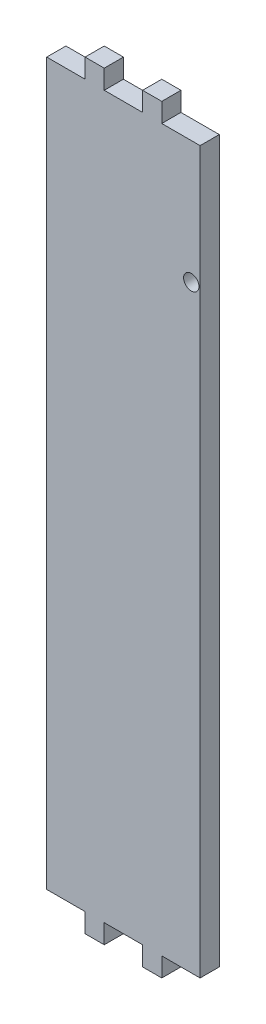
ISO-10303-21;
HEADER;
FILE_DESCRIPTION(('STEP AP214'),'2;1');
FILE_NAME('part.step','',(''),(''),'','','');
FILE_SCHEMA(('AUTOMOTIVE_DESIGN { 1 0 10303 214 1 1 1 1 }'));
ENDSEC;
DATA;
#1=APPLICATION_CONTEXT('core data for automotive mechanical design processes');
#2=APPLICATION_PROTOCOL_DEFINITION('international standard','automotive_design',2000,#1);
#3=PRODUCT_CONTEXT('',#1,'mechanical');
#4=PRODUCT('Part','Part','',(#3));
#5=PRODUCT_RELATED_PRODUCT_CATEGORY('part','',(#4));
#6=PRODUCT_DEFINITION_FORMATION('','',#4);
#7=PRODUCT_DEFINITION_CONTEXT('part definition',#1,'design');
#8=PRODUCT_DEFINITION('design','',#6,#7);
#9=PRODUCT_DEFINITION_SHAPE('','',#8);
#10=(LENGTH_UNIT() NAMED_UNIT(*) SI_UNIT(.MILLI.,.METRE.));
#11=(NAMED_UNIT(*) PLANE_ANGLE_UNIT() SI_UNIT($,.RADIAN.));
#12=(NAMED_UNIT(*) SI_UNIT($,.STERADIAN.) SOLID_ANGLE_UNIT());
#13=UNCERTAINTY_MEASURE_WITH_UNIT(LENGTH_MEASURE(1.E-05),#10,'distance_accuracy_value','');
#14=(GEOMETRIC_REPRESENTATION_CONTEXT(3) GLOBAL_UNCERTAINTY_ASSIGNED_CONTEXT((#13)) GLOBAL_UNIT_ASSIGNED_CONTEXT((#10,
#11,#12)) REPRESENTATION_CONTEXT('',''));
#15=CARTESIAN_POINT('',(0.,0.,0.));
#16=DIRECTION('',(0.,0.,1.));
#17=DIRECTION('',(1.,0.,0.));
#18=AXIS2_PLACEMENT_3D('',#15,#16,#17);
#19=CARTESIAN_POINT('',(10.0000000000001,0.,5.));
#20=DIRECTION('',(1.,0.,0.));
#21=DIRECTION('',(0.,1.,0.));
#22=AXIS2_PLACEMENT_3D('',#19,#20,#21);
#23=PLANE('',#22);
#24=DIRECTION('',(0.,-1.,0.));
#25=VECTOR('',#24,1.);
#26=CARTESIAN_POINT('',(10.0000000000001,0.,0.));
#27=LINE('',#26,#25);
#28=CARTESIAN_POINT('',(10.,193.,0.));
#29=VERTEX_POINT('',#28);
#30=CARTESIAN_POINT('',(10.,188.,0.));
#31=VERTEX_POINT('',#30);
#32=EDGE_CURVE('E207',#29,#31,#27,.T.);
#33=ORIENTED_EDGE('',*,*,#32,.F.);
#34=DIRECTION('',(0.,0.,-1.));
#35=VECTOR('',#34,1.);
#36=CARTESIAN_POINT('',(10.,193.,5.));
#37=LINE('',#36,#35);
#38=CARTESIAN_POINT('',(10.,193.,5.));
#39=VERTEX_POINT('',#38);
#40=EDGE_CURVE('E11',#39,#29,#37,.T.);
#41=ORIENTED_EDGE('',*,*,#40,.F.);
#42=DIRECTION('',(0.,-1.,0.));
#43=VECTOR('',#42,1.);
#44=CARTESIAN_POINT('',(10.0000000000001,0.,5.));
#45=LINE('',#44,#43);
#46=CARTESIAN_POINT('',(10.,188.,5.));
#47=VERTEX_POINT('',#46);
#48=EDGE_CURVE('E258',#39,#47,#45,.T.);
#49=ORIENTED_EDGE('',*,*,#48,.T.);
#50=DIRECTION('',(0.,0.,-1.));
#51=VECTOR('',#50,1.);
#52=CARTESIAN_POINT('',(10.,188.,5.));
#53=LINE('',#52,#51);
#54=EDGE_CURVE('E126',#47,#31,#53,.T.);
#55=ORIENTED_EDGE('',*,*,#54,.T.);
#56=EDGE_LOOP('',(#33,#41,#49,#55));
#57=FACE_BOUND('',#56,.T.);
#58=ADVANCED_FACE('F39',(#57),#23,.T.);
#59=CARTESIAN_POINT('',(0.,193.,5.));
#60=DIRECTION('',(0.,1.,0.));
#61=DIRECTION('',(0.,0.,1.));
#62=AXIS2_PLACEMENT_3D('',#59,#60,#61);
#63=PLANE('',#62);
#64=DIRECTION('',(1.,0.,0.));
#65=VECTOR('',#64,1.);
#66=CARTESIAN_POINT('',(0.,193.,0.));
#67=LINE('',#66,#65);
#68=CARTESIAN_POINT('',(5.,193.,0.));
#69=VERTEX_POINT('',#68);
#70=EDGE_CURVE('E210',#69,#29,#67,.T.);
#71=ORIENTED_EDGE('',*,*,#70,.F.);
#72=DIRECTION('',(0.,0.,-1.));
#73=VECTOR('',#72,1.);
#74=CARTESIAN_POINT('',(5.,193.,5.));
#75=LINE('',#74,#73);
#76=CARTESIAN_POINT('',(5.,193.,5.));
#77=VERTEX_POINT('',#76);
#78=EDGE_CURVE('E47',#77,#69,#75,.T.);
#79=ORIENTED_EDGE('',*,*,#78,.F.);
#80=DIRECTION('',(1.,0.,0.));
#81=VECTOR('',#80,1.);
#82=CARTESIAN_POINT('',(0.,193.,5.));
#83=LINE('',#82,#81);
#84=EDGE_CURVE('E319',#77,#39,#83,.T.);
#85=ORIENTED_EDGE('',*,*,#84,.T.);
#86=ORIENTED_EDGE('',*,*,#40,.T.);
#87=EDGE_LOOP('',(#71,#79,#85,#86));
#88=FACE_BOUND('',#87,.T.);
#89=ADVANCED_FACE('F305',(#88),#63,.T.);
#90=CARTESIAN_POINT('',(5.00000000000007,0.,5.));
#91=DIRECTION('',(-1.,0.,0.));
#92=DIRECTION('',(0.,-1.,0.));
#93=AXIS2_PLACEMENT_3D('',#90,#91,#92);
#94=PLANE('',#93);
#95=DIRECTION('',(0.,1.,0.));
#96=VECTOR('',#95,1.);
#97=CARTESIAN_POINT('',(5.00000000000007,0.,0.));
#98=LINE('',#97,#96);
#99=CARTESIAN_POINT('',(5.,188.,0.));
#100=VERTEX_POINT('',#99);
#101=EDGE_CURVE('E213',#100,#69,#98,.T.);
#102=ORIENTED_EDGE('',*,*,#101,.F.);
#103=DIRECTION('',(0.,0.,-1.));
#104=VECTOR('',#103,1.);
#105=CARTESIAN_POINT('',(5.,188.,5.));
#106=LINE('',#105,#104);
#107=CARTESIAN_POINT('',(5.,188.,5.));
#108=VERTEX_POINT('',#107);
#109=EDGE_CURVE('E294',#108,#100,#106,.T.);
#110=ORIENTED_EDGE('',*,*,#109,.F.);
#111=DIRECTION('',(0.,1.,0.));
#112=VECTOR('',#111,1.);
#113=CARTESIAN_POINT('',(5.00000000000007,0.,5.));
#114=LINE('',#113,#112);
#115=EDGE_CURVE('E301',#108,#77,#114,.T.);
#116=ORIENTED_EDGE('',*,*,#115,.T.);
#117=ORIENTED_EDGE('',*,*,#78,.T.);
#118=EDGE_LOOP('',(#102,#110,#116,#117));
#119=FACE_BOUND('',#118,.T.);
#120=ADVANCED_FACE('F299',(#119),#94,.T.);
#121=CARTESIAN_POINT('',(0.,188.,5.));
#122=DIRECTION('',(0.,1.,0.));
#123=DIRECTION('',(0.,0.,1.));
#124=AXIS2_PLACEMENT_3D('',#121,#122,#123);
#125=PLANE('',#124);
#126=DIRECTION('',(1.,0.,0.));
#127=VECTOR('',#126,1.);
#128=CARTESIAN_POINT('',(0.,188.,0.));
#129=LINE('',#128,#127);
#130=CARTESIAN_POINT('',(-5.,188.,0.));
#131=VERTEX_POINT('',#130);
#132=EDGE_CURVE('E216',#131,#100,#129,.T.);
#133=ORIENTED_EDGE('',*,*,#132,.F.);
#134=DIRECTION('',(0.,0.,-1.));
#135=VECTOR('',#134,1.);
#136=CARTESIAN_POINT('',(-5.,188.,5.));
#137=LINE('',#136,#135);
#138=CARTESIAN_POINT('',(-5.,188.,5.));
#139=VERTEX_POINT('',#138);
#140=EDGE_CURVE('E292',#139,#131,#137,.T.);
#141=ORIENTED_EDGE('',*,*,#140,.F.);
#142=DIRECTION('',(1.,0.,0.));
#143=VECTOR('',#142,1.);
#144=CARTESIAN_POINT('',(0.,188.,5.));
#145=LINE('',#144,#143);
#146=EDGE_CURVE('E316',#139,#108,#145,.T.);
#147=ORIENTED_EDGE('',*,*,#146,.T.);
#148=ORIENTED_EDGE('',*,*,#109,.T.);
#149=EDGE_LOOP('',(#133,#141,#147,#148));
#150=FACE_BOUND('',#149,.T.);
#151=ADVANCED_FACE('F313',(#150),#125,.T.);
#152=CARTESIAN_POINT('',(-4.99999999999994,0.,5.));
#153=DIRECTION('',(1.,0.,0.));
#154=DIRECTION('',(0.,1.,0.));
#155=AXIS2_PLACEMENT_3D('',#152,#153,#154);
#156=PLANE('',#155);
#157=DIRECTION('',(0.,-1.,0.));
#158=VECTOR('',#157,1.);
#159=CARTESIAN_POINT('',(-4.99999999999994,0.,0.));
#160=LINE('',#159,#158);
#161=CARTESIAN_POINT('',(-5.,193.,0.));
#162=VERTEX_POINT('',#161);
#163=EDGE_CURVE('E219',#162,#131,#160,.T.);
#164=ORIENTED_EDGE('',*,*,#163,.F.);
#165=DIRECTION('',(0.,0.,-1.));
#166=VECTOR('',#165,1.);
#167=CARTESIAN_POINT('',(-5.,193.,5.));
#168=LINE('',#167,#166);
#169=CARTESIAN_POINT('',(-5.,193.,5.));
#170=VERTEX_POINT('',#169);
#171=EDGE_CURVE('E290',#170,#162,#168,.T.);
#172=ORIENTED_EDGE('',*,*,#171,.F.);
#173=DIRECTION('',(0.,-1.,0.));
#174=VECTOR('',#173,1.);
#175=CARTESIAN_POINT('',(-4.99999999999994,0.,5.));
#176=LINE('',#175,#174);
#177=EDGE_CURVE('E321',#170,#139,#176,.T.);
#178=ORIENTED_EDGE('',*,*,#177,.T.);
#179=ORIENTED_EDGE('',*,*,#140,.T.);
#180=EDGE_LOOP('',(#164,#172,#178,#179));
#181=FACE_BOUND('',#180,.T.);
#182=ADVANCED_FACE('F376',(#181),#156,.T.);
#183=CARTESIAN_POINT('',(0.,193.,5.));
#184=DIRECTION('',(0.,-1.,0.));
#185=DIRECTION('',(0.,0.,-1.));
#186=AXIS2_PLACEMENT_3D('',#183,#184,#185);
#187=PLANE('',#186);
#188=DIRECTION('',(-1.,0.,0.));
#189=VECTOR('',#188,1.);
#190=CARTESIAN_POINT('',(0.,193.,0.));
#191=LINE('',#190,#189);
#192=CARTESIAN_POINT('',(-10.,193.,0.));
#193=VERTEX_POINT('',#192);
#194=EDGE_CURVE('E222',#162,#193,#191,.T.);
#195=ORIENTED_EDGE('',*,*,#194,.T.);
#196=DIRECTION('',(0.,0.,-1.));
#197=VECTOR('',#196,1.);
#198=CARTESIAN_POINT('',(-10.,193.,5.));
#199=LINE('',#198,#197);
#200=CARTESIAN_POINT('',(-10.,193.,5.));
#201=VERTEX_POINT('',#200);
#202=EDGE_CURVE('E287',#201,#193,#199,.T.);
#203=ORIENTED_EDGE('',*,*,#202,.F.);
#204=DIRECTION('',(-1.,0.,0.));
#205=VECTOR('',#204,1.);
#206=CARTESIAN_POINT('',(0.,193.,5.));
#207=LINE('',#206,#205);
#208=EDGE_CURVE('E327',#170,#201,#207,.T.);
#209=ORIENTED_EDGE('',*,*,#208,.F.);
#210=ORIENTED_EDGE('',*,*,#171,.T.);
#211=EDGE_LOOP('',(#195,#203,#209,#210));
#212=FACE_BOUND('',#211,.T.);
#213=ADVANCED_FACE('F379',(#212),#187,.F.);
#214=CARTESIAN_POINT('',(-9.99999999999994,0.,5.));
#215=DIRECTION('',(1.,0.,0.));
#216=DIRECTION('',(0.,1.,0.));
#217=AXIS2_PLACEMENT_3D('',#214,#215,#216);
#218=PLANE('',#217);
#219=DIRECTION('',(0.,-1.,0.));
#220=VECTOR('',#219,1.);
#221=CARTESIAN_POINT('',(-9.99999999999994,0.,0.));
#222=LINE('',#221,#220);
#223=CARTESIAN_POINT('',(-10.,188.,0.));
#224=VERTEX_POINT('',#223);
#225=EDGE_CURVE('E224',#193,#224,#222,.T.);
#226=ORIENTED_EDGE('',*,*,#225,.T.);
#227=DIRECTION('',(0.,0.,-1.));
#228=VECTOR('',#227,1.);
#229=CARTESIAN_POINT('',(-10.,188.,5.));
#230=LINE('',#229,#228);
#231=CARTESIAN_POINT('',(-10.,188.,5.));
#232=VERTEX_POINT('',#231);
#233=EDGE_CURVE('E284',#232,#224,#230,.T.);
#234=ORIENTED_EDGE('',*,*,#233,.F.);
#235=DIRECTION('',(0.,-1.,0.));
#236=VECTOR('',#235,1.);
#237=CARTESIAN_POINT('',(-9.99999999999994,0.,5.));
#238=LINE('',#237,#236);
#239=EDGE_CURVE('E329',#201,#232,#238,.T.);
#240=ORIENTED_EDGE('',*,*,#239,.F.);
#241=ORIENTED_EDGE('',*,*,#202,.T.);
#242=EDGE_LOOP('',(#226,#234,#240,#241));
#243=FACE_BOUND('',#242,.T.);
#244=ADVANCED_FACE('F383',(#243),#218,.F.);
#245=CARTESIAN_POINT('',(0.,188.,5.));
#246=DIRECTION('',(0.,-1.,0.));
#247=DIRECTION('',(0.,0.,-1.));
#248=AXIS2_PLACEMENT_3D('',#245,#246,#247);
#249=PLANE('',#248);
#250=DIRECTION('',(-1.,0.,0.));
#251=VECTOR('',#250,1.);
#252=CARTESIAN_POINT('',(0.,188.,0.));
#253=LINE('',#252,#251);
#254=CARTESIAN_POINT('',(-20.,188.,0.));
#255=VERTEX_POINT('',#254);
#256=EDGE_CURVE('E226',#224,#255,#253,.T.);
#257=ORIENTED_EDGE('',*,*,#256,.T.);
#258=DIRECTION('',(0.,0.,-1.));
#259=VECTOR('',#258,1.);
#260=CARTESIAN_POINT('',(-20.,188.,5.));
#261=LINE('',#260,#259);
#262=CARTESIAN_POINT('',(-20.,188.,5.));
#263=VERTEX_POINT('',#262);
#264=EDGE_CURVE('E281',#263,#255,#261,.T.);
#265=ORIENTED_EDGE('',*,*,#264,.F.);
#266=DIRECTION('',(-1.,0.,0.));
#267=VECTOR('',#266,1.);
#268=CARTESIAN_POINT('',(0.,188.,5.));
#269=LINE('',#268,#267);
#270=EDGE_CURVE('E331',#232,#263,#269,.T.);
#271=ORIENTED_EDGE('',*,*,#270,.F.);
#272=ORIENTED_EDGE('',*,*,#233,.T.);
#273=EDGE_LOOP('',(#257,#265,#271,#272));
#274=FACE_BOUND('',#273,.T.);
#275=ADVANCED_FACE('F387',(#274),#249,.F.);
#276=CARTESIAN_POINT('',(-20.,0.,5.));
#277=DIRECTION('',(1.,0.,0.));
#278=DIRECTION('',(0.,1.,0.));
#279=AXIS2_PLACEMENT_3D('',#276,#277,#278);
#280=PLANE('',#279);
#281=DIRECTION('',(0.,-1.,0.));
#282=VECTOR('',#281,1.);
#283=CARTESIAN_POINT('',(-20.,0.,0.));
#284=LINE('',#283,#282);
#285=CARTESIAN_POINT('',(-20.,0.,0.));
#286=VERTEX_POINT('',#285);
#287=EDGE_CURVE('E228',#255,#286,#284,.T.);
#288=ORIENTED_EDGE('',*,*,#287,.T.);
#289=DIRECTION('',(0.,0.,-1.));
#290=VECTOR('',#289,1.);
#291=CARTESIAN_POINT('',(-20.,0.,5.));
#292=LINE('',#291,#290);
#293=CARTESIAN_POINT('',(-20.,0.,5.));
#294=VERTEX_POINT('',#293);
#295=EDGE_CURVE('E278',#294,#286,#292,.T.);
#296=ORIENTED_EDGE('',*,*,#295,.F.);
#297=DIRECTION('',(0.,-1.,0.));
#298=VECTOR('',#297,1.);
#299=CARTESIAN_POINT('',(-20.,0.,5.));
#300=LINE('',#299,#298);
#301=EDGE_CURVE('E333',#263,#294,#300,.T.);
#302=ORIENTED_EDGE('',*,*,#301,.F.);
#303=ORIENTED_EDGE('',*,*,#264,.T.);
#304=EDGE_LOOP('',(#288,#296,#302,#303));
#305=FACE_BOUND('',#304,.T.);
#306=ADVANCED_FACE('F391',(#305),#280,.F.);
#307=CARTESIAN_POINT('',(0.,0.,5.));
#308=DIRECTION('',(0.,1.,0.));
#309=DIRECTION('',(-1.,0.,0.));
#310=AXIS2_PLACEMENT_3D('',#307,#308,#309);
#311=PLANE('',#310);
#312=DIRECTION('',(1.,0.,0.));
#313=VECTOR('',#312,1.);
#314=CARTESIAN_POINT('',(0.,0.,0.));
#315=LINE('',#314,#313);
#316=CARTESIAN_POINT('',(-10.,0.,0.));
#317=VERTEX_POINT('',#316);
#318=EDGE_CURVE('E230',#286,#317,#315,.T.);
#319=ORIENTED_EDGE('',*,*,#318,.T.);
#320=DIRECTION('',(0.,0.,-1.));
#321=VECTOR('',#320,1.);
#322=CARTESIAN_POINT('',(-10.,0.,5.));
#323=LINE('',#322,#321);
#324=CARTESIAN_POINT('',(-10.,0.,5.));
#325=VERTEX_POINT('',#324);
#326=EDGE_CURVE('E276',#325,#317,#323,.T.);
#327=ORIENTED_EDGE('',*,*,#326,.F.);
#328=DIRECTION('',(1.,0.,0.));
#329=VECTOR('',#328,1.);
#330=CARTESIAN_POINT('',(0.,0.,5.));
#331=LINE('',#330,#329);
#332=EDGE_CURVE('E335',#294,#325,#331,.T.);
#333=ORIENTED_EDGE('',*,*,#332,.F.);
#334=ORIENTED_EDGE('',*,*,#295,.T.);
#335=EDGE_LOOP('',(#319,#327,#333,#334));
#336=FACE_BOUND('',#335,.T.);
#337=ADVANCED_FACE('F395',(#336),#311,.F.);
#338=CARTESIAN_POINT('',(-10.,0.,5.));
#339=DIRECTION('',(-1.,0.,0.));
#340=DIRECTION('',(0.,0.,1.));
#341=AXIS2_PLACEMENT_3D('',#338,#339,#340);
#342=PLANE('',#341);
#343=DIRECTION('',(0.,1.,0.));
#344=VECTOR('',#343,1.);
#345=CARTESIAN_POINT('',(-10.,0.,0.));
#346=LINE('',#345,#344);
#347=CARTESIAN_POINT('',(-10.,-5.,0.));
#348=VERTEX_POINT('',#347);
#349=EDGE_CURVE('E233',#348,#317,#346,.T.);
#350=ORIENTED_EDGE('',*,*,#349,.F.);
#351=DIRECTION('',(0.,0.,-1.));
#352=VECTOR('',#351,1.);
#353=CARTESIAN_POINT('',(-10.,-5.,5.));
#354=LINE('',#353,#352);
#355=CARTESIAN_POINT('',(-10.,-5.,5.));
#356=VERTEX_POINT('',#355);
#357=EDGE_CURVE('E274',#356,#348,#354,.T.);
#358=ORIENTED_EDGE('',*,*,#357,.F.);
#359=DIRECTION('',(0.,1.,0.));
#360=VECTOR('',#359,1.);
#361=CARTESIAN_POINT('',(-10.,0.,5.));
#362=LINE('',#361,#360);
#363=EDGE_CURVE('E337',#356,#325,#362,.T.);
#364=ORIENTED_EDGE('',*,*,#363,.T.);
#365=ORIENTED_EDGE('',*,*,#326,.T.);
#366=EDGE_LOOP('',(#350,#358,#364,#365));
#367=FACE_BOUND('',#366,.T.);
#368=ADVANCED_FACE('F399',(#367),#342,.T.);
#369=CARTESIAN_POINT('',(0.,-5.,5.));
#370=DIRECTION('',(0.,-1.,0.));
#371=DIRECTION('',(1.,0.,0.));
#372=AXIS2_PLACEMENT_3D('',#369,#370,#371);
#373=PLANE('',#372);
#374=DIRECTION('',(-1.,0.,0.));
#375=VECTOR('',#374,1.);
#376=CARTESIAN_POINT('',(0.,-5.,0.));
#377=LINE('',#376,#375);
#378=CARTESIAN_POINT('',(-5.,-5.,0.));
#379=VERTEX_POINT('',#378);
#380=EDGE_CURVE('E236',#379,#348,#377,.T.);
#381=ORIENTED_EDGE('',*,*,#380,.F.);
#382=DIRECTION('',(0.,0.,-1.));
#383=VECTOR('',#382,1.);
#384=CARTESIAN_POINT('',(-5.,-5.,5.));
#385=LINE('',#384,#383);
#386=CARTESIAN_POINT('',(-5.,-5.,5.));
#387=VERTEX_POINT('',#386);
#388=EDGE_CURVE('E272',#387,#379,#385,.T.);
#389=ORIENTED_EDGE('',*,*,#388,.F.);
#390=DIRECTION('',(-1.,0.,0.));
#391=VECTOR('',#390,1.);
#392=CARTESIAN_POINT('',(0.,-5.,5.));
#393=LINE('',#392,#391);
#394=EDGE_CURVE('E340',#387,#356,#393,.T.);
#395=ORIENTED_EDGE('',*,*,#394,.T.);
#396=ORIENTED_EDGE('',*,*,#357,.T.);
#397=EDGE_LOOP('',(#381,#389,#395,#396));
#398=FACE_BOUND('',#397,.T.);
#399=ADVANCED_FACE('F403',(#398),#373,.T.);
#400=CARTESIAN_POINT('',(-5.,0.,5.));
#401=DIRECTION('',(-1.,0.,0.));
#402=DIRECTION('',(0.,0.,1.));
#403=AXIS2_PLACEMENT_3D('',#400,#401,#402);
#404=PLANE('',#403);
#405=DIRECTION('',(0.,1.,0.));
#406=VECTOR('',#405,1.);
#407=CARTESIAN_POINT('',(-5.,0.,0.));
#408=LINE('',#407,#406);
#409=CARTESIAN_POINT('',(-5.,0.,0.));
#410=VERTEX_POINT('',#409);
#411=EDGE_CURVE('E239',#379,#410,#408,.T.);
#412=ORIENTED_EDGE('',*,*,#411,.T.);
#413=DIRECTION('',(0.,0.,-1.));
#414=VECTOR('',#413,1.);
#415=CARTESIAN_POINT('',(-5.,0.,5.));
#416=LINE('',#415,#414);
#417=CARTESIAN_POINT('',(-5.,0.,5.));
#418=VERTEX_POINT('',#417);
#419=EDGE_CURVE('E270',#418,#410,#416,.T.);
#420=ORIENTED_EDGE('',*,*,#419,.F.);
#421=DIRECTION('',(0.,1.,0.));
#422=VECTOR('',#421,1.);
#423=CARTESIAN_POINT('',(-5.,0.,5.));
#424=LINE('',#423,#422);
#425=EDGE_CURVE('E343',#387,#418,#424,.T.);
#426=ORIENTED_EDGE('',*,*,#425,.F.);
#427=ORIENTED_EDGE('',*,*,#388,.T.);
#428=EDGE_LOOP('',(#412,#420,#426,#427));
#429=FACE_BOUND('',#428,.T.);
#430=ADVANCED_FACE('F407',(#429),#404,.F.);
#431=CARTESIAN_POINT('',(0.,0.,5.));
#432=DIRECTION('',(0.,-1.,0.));
#433=DIRECTION('',(1.,0.,0.));
#434=AXIS2_PLACEMENT_3D('',#431,#432,#433);
#435=PLANE('',#434);
#436=DIRECTION('',(-1.,0.,0.));
#437=VECTOR('',#436,1.);
#438=CARTESIAN_POINT('',(0.,0.,0.));
#439=LINE('',#438,#437);
#440=CARTESIAN_POINT('',(5.,0.,0.));
#441=VERTEX_POINT('',#440);
#442=EDGE_CURVE('E242',#441,#410,#439,.T.);
#443=ORIENTED_EDGE('',*,*,#442,.F.);
#444=DIRECTION('',(0.,0.,-1.));
#445=VECTOR('',#444,1.);
#446=CARTESIAN_POINT('',(5.,0.,5.));
#447=LINE('',#446,#445);
#448=CARTESIAN_POINT('',(5.,0.,5.));
#449=VERTEX_POINT('',#448);
#450=EDGE_CURVE('E268',#449,#441,#447,.T.);
#451=ORIENTED_EDGE('',*,*,#450,.F.);
#452=DIRECTION('',(-1.,0.,0.));
#453=VECTOR('',#452,1.);
#454=CARTESIAN_POINT('',(0.,0.,5.));
#455=LINE('',#454,#453);
#456=EDGE_CURVE('E345',#449,#418,#455,.T.);
#457=ORIENTED_EDGE('',*,*,#456,.T.);
#458=ORIENTED_EDGE('',*,*,#419,.T.);
#459=EDGE_LOOP('',(#443,#451,#457,#458));
#460=FACE_BOUND('',#459,.T.);
#461=ADVANCED_FACE('F411',(#460),#435,.T.);
#462=CARTESIAN_POINT('',(5.,0.,5.));
#463=DIRECTION('',(1.,0.,0.));
#464=DIRECTION('',(0.,0.,-1.));
#465=AXIS2_PLACEMENT_3D('',#462,#463,#464);
#466=PLANE('',#465);
#467=DIRECTION('',(0.,-1.,0.));
#468=VECTOR('',#467,1.);
#469=CARTESIAN_POINT('',(5.,0.,0.));
#470=LINE('',#469,#468);
#471=CARTESIAN_POINT('',(5.,-5.,0.));
#472=VERTEX_POINT('',#471);
#473=EDGE_CURVE('E245',#441,#472,#470,.T.);
#474=ORIENTED_EDGE('',*,*,#473,.T.);
#475=DIRECTION('',(0.,0.,-1.));
#476=VECTOR('',#475,1.);
#477=CARTESIAN_POINT('',(5.,-5.,5.));
#478=LINE('',#477,#476);
#479=CARTESIAN_POINT('',(5.,-5.,5.));
#480=VERTEX_POINT('',#479);
#481=EDGE_CURVE('E265',#480,#472,#478,.T.);
#482=ORIENTED_EDGE('',*,*,#481,.F.);
#483=DIRECTION('',(0.,-1.,0.));
#484=VECTOR('',#483,1.);
#485=CARTESIAN_POINT('',(5.,0.,5.));
#486=LINE('',#485,#484);
#487=EDGE_CURVE('E348',#449,#480,#486,.T.);
#488=ORIENTED_EDGE('',*,*,#487,.F.);
#489=ORIENTED_EDGE('',*,*,#450,.T.);
#490=EDGE_LOOP('',(#474,#482,#488,#489));
#491=FACE_BOUND('',#490,.T.);
#492=ADVANCED_FACE('F415',(#491),#466,.F.);
#493=CARTESIAN_POINT('',(0.,-5.,5.));
#494=DIRECTION('',(0.,1.,0.));
#495=DIRECTION('',(-1.,0.,0.));
#496=AXIS2_PLACEMENT_3D('',#493,#494,#495);
#497=PLANE('',#496);
#498=DIRECTION('',(1.,0.,0.));
#499=VECTOR('',#498,1.);
#500=CARTESIAN_POINT('',(0.,-5.,0.));
#501=LINE('',#500,#499);
#502=CARTESIAN_POINT('',(10.,-5.,0.));
#503=VERTEX_POINT('',#502);
#504=EDGE_CURVE('E247',#472,#503,#501,.T.);
#505=ORIENTED_EDGE('',*,*,#504,.T.);
#506=DIRECTION('',(0.,0.,-1.));
#507=VECTOR('',#506,1.);
#508=CARTESIAN_POINT('',(10.,-5.,5.));
#509=LINE('',#508,#507);
#510=CARTESIAN_POINT('',(10.,-5.,5.));
#511=VERTEX_POINT('',#510);
#512=EDGE_CURVE('E262',#511,#503,#509,.T.);
#513=ORIENTED_EDGE('',*,*,#512,.F.);
#514=DIRECTION('',(1.,0.,0.));
#515=VECTOR('',#514,1.);
#516=CARTESIAN_POINT('',(0.,-5.,5.));
#517=LINE('',#516,#515);
#518=EDGE_CURVE('E350',#480,#511,#517,.T.);
#519=ORIENTED_EDGE('',*,*,#518,.F.);
#520=ORIENTED_EDGE('',*,*,#481,.T.);
#521=EDGE_LOOP('',(#505,#513,#519,#520));
#522=FACE_BOUND('',#521,.T.);
#523=ADVANCED_FACE('F357',(#522),#497,.F.);
#524=CARTESIAN_POINT('',(10.,0.,5.));
#525=DIRECTION('',(-1.,0.,0.));
#526=DIRECTION('',(0.,0.,1.));
#527=AXIS2_PLACEMENT_3D('',#524,#525,#526);
#528=PLANE('',#527);
#529=DIRECTION('',(0.,1.,0.));
#530=VECTOR('',#529,1.);
#531=CARTESIAN_POINT('',(10.,0.,0.));
#532=LINE('',#531,#530);
#533=CARTESIAN_POINT('',(10.,0.,0.));
#534=VERTEX_POINT('',#533);
#535=EDGE_CURVE('E249',#503,#534,#532,.T.);
#536=ORIENTED_EDGE('',*,*,#535,.T.);
#537=DIRECTION('',(0.,0.,-1.));
#538=VECTOR('',#537,1.);
#539=CARTESIAN_POINT('',(10.,0.,5.));
#540=LINE('',#539,#538);
#541=CARTESIAN_POINT('',(10.,0.,5.));
#542=VERTEX_POINT('',#541);
#543=EDGE_CURVE('E196',#542,#534,#540,.T.);
#544=ORIENTED_EDGE('',*,*,#543,.F.);
#545=DIRECTION('',(0.,1.,0.));
#546=VECTOR('',#545,1.);
#547=CARTESIAN_POINT('',(10.,0.,5.));
#548=LINE('',#547,#546);
#549=EDGE_CURVE('E187',#511,#542,#548,.T.);
#550=ORIENTED_EDGE('',*,*,#549,.F.);
#551=ORIENTED_EDGE('',*,*,#512,.T.);
#552=EDGE_LOOP('',(#536,#544,#550,#551));
#553=FACE_BOUND('',#552,.T.);
#554=ADVANCED_FACE('F361',(#553),#528,.F.);
#555=CARTESIAN_POINT('',(0.,0.,5.));
#556=DIRECTION('',(0.,1.,0.));
#557=DIRECTION('',(-1.,0.,0.));
#558=AXIS2_PLACEMENT_3D('',#555,#556,#557);
#559=PLANE('',#558);
#560=DIRECTION('',(1.,0.,0.));
#561=VECTOR('',#560,1.);
#562=CARTESIAN_POINT('',(0.,0.,0.));
#563=LINE('',#562,#561);
#564=CARTESIAN_POINT('',(20.,0.,0.));
#565=VERTEX_POINT('',#564);
#566=EDGE_CURVE('E195',#534,#565,#563,.T.);
#567=ORIENTED_EDGE('',*,*,#566,.T.);
#568=DIRECTION('',(0.,0.,-1.));
#569=VECTOR('',#568,1.);
#570=CARTESIAN_POINT('',(20.,0.,5.));
#571=LINE('',#570,#569);
#572=CARTESIAN_POINT('',(20.,0.,5.));
#573=VERTEX_POINT('',#572);
#574=EDGE_CURVE('E192',#573,#565,#571,.T.);
#575=ORIENTED_EDGE('',*,*,#574,.F.);
#576=DIRECTION('',(1.,0.,0.));
#577=VECTOR('',#576,1.);
#578=CARTESIAN_POINT('',(0.,0.,5.));
#579=LINE('',#578,#577);
#580=EDGE_CURVE('E180',#542,#573,#579,.T.);
#581=ORIENTED_EDGE('',*,*,#580,.F.);
#582=ORIENTED_EDGE('',*,*,#543,.T.);
#583=EDGE_LOOP('',(#567,#575,#581,#582));
#584=FACE_BOUND('',#583,.T.);
#585=ADVANCED_FACE('F193',(#584),#559,.F.);
#586=CARTESIAN_POINT('',(20.,0.,5.));
#587=DIRECTION('',(-1.,0.,0.));
#588=DIRECTION('',(0.,0.,1.));
#589=AXIS2_PLACEMENT_3D('',#586,#587,#588);
#590=PLANE('',#589);
#591=DIRECTION('',(0.,1.,0.));
#592=VECTOR('',#591,1.);
#593=CARTESIAN_POINT('',(20.,0.,0.));
#594=LINE('',#593,#592);
#595=CARTESIAN_POINT('',(20.,188.,0.));
#596=VERTEX_POINT('',#595);
#597=EDGE_CURVE('E119',#565,#596,#594,.T.);
#598=ORIENTED_EDGE('',*,*,#597,.T.);
#599=DIRECTION('',(0.,0.,-1.));
#600=VECTOR('',#599,1.);
#601=CARTESIAN_POINT('',(20.,188.,5.));
#602=LINE('',#601,#600);
#603=CARTESIAN_POINT('',(20.,188.,5.));
#604=VERTEX_POINT('',#603);
#605=EDGE_CURVE('E197',#604,#596,#602,.T.);
#606=ORIENTED_EDGE('',*,*,#605,.F.);
#607=DIRECTION('',(0.,1.,0.));
#608=VECTOR('',#607,1.);
#609=CARTESIAN_POINT('',(20.,0.,5.));
#610=LINE('',#609,#608);
#611=EDGE_CURVE('E185',#573,#604,#610,.T.);
#612=ORIENTED_EDGE('',*,*,#611,.F.);
#613=ORIENTED_EDGE('',*,*,#574,.T.);
#614=EDGE_LOOP('',(#598,#606,#612,#613));
#615=FACE_BOUND('',#614,.T.);
#616=ADVANCED_FACE('F199',(#615),#590,.F.);
#617=CARTESIAN_POINT('',(0.,188.,5.));
#618=DIRECTION('',(0.,-1.,0.));
#619=DIRECTION('',(0.,0.,-1.));
#620=AXIS2_PLACEMENT_3D('',#617,#618,#619);
#621=PLANE('',#620);
#622=DIRECTION('',(-1.,0.,0.));
#623=VECTOR('',#622,1.);
#624=CARTESIAN_POINT('',(0.,188.,0.));
#625=LINE('',#624,#623);
#626=EDGE_CURVE('E253',#596,#31,#625,.T.);
#627=ORIENTED_EDGE('',*,*,#626,.T.);
#628=ORIENTED_EDGE('',*,*,#54,.F.);
#629=DIRECTION('',(-1.,0.,0.));
#630=VECTOR('',#629,1.);
#631=CARTESIAN_POINT('',(0.,188.,5.));
#632=LINE('',#631,#630);
#633=EDGE_CURVE('E55',#604,#47,#632,.T.);
#634=ORIENTED_EDGE('',*,*,#633,.F.);
#635=ORIENTED_EDGE('',*,*,#605,.T.);
#636=EDGE_LOOP('',(#627,#628,#634,#635));
#637=FACE_BOUND('',#636,.T.);
#638=ADVANCED_FACE('F364',(#637),#621,.F.);
#639=CARTESIAN_POINT('',(17.7,156.,5.));
#640=DIRECTION('',(0.,0.,-1.));
#641=DIRECTION('',(-1.,0.,0.));
#642=AXIS2_PLACEMENT_3D('',#639,#640,#641);
#643=CYLINDRICAL_SURFACE('',#642,2.);
#644=CARTESIAN_POINT('',(17.7,156.,5.));
#645=DIRECTION('',(0.,0.,1.));
#646=DIRECTION('',(1.,0.,0.));
#647=AXIS2_PLACEMENT_3D('',#644,#645,#646);
#648=CIRCLE('',#647,2.);
#649=CARTESIAN_POINT('',(19.7,156.,5.));
#650=VERTEX_POINT('',#649);
#651=EDGE_CURVE('E201',#650,#650,#648,.T.);
#652=ORIENTED_EDGE('',*,*,#651,.T.);
#653=EDGE_LOOP('',(#652));
#654=FACE_BOUND('',#653,.T.);
#655=CARTESIAN_POINT('',(17.7,156.,0.));
#656=DIRECTION('',(0.,0.,1.));
#657=DIRECTION('',(1.,0.,0.));
#658=AXIS2_PLACEMENT_3D('',#655,#656,#657);
#659=CIRCLE('',#658,2.);
#660=CARTESIAN_POINT('',(19.7,156.,0.));
#661=VERTEX_POINT('',#660);
#662=EDGE_CURVE('E255',#661,#661,#659,.T.);
#663=ORIENTED_EDGE('',*,*,#662,.F.);
#664=EDGE_LOOP('',(#663));
#665=FACE_BOUND('',#664,.T.);
#666=ADVANCED_FACE('F430',(#654,#665),#643,.F.);
#667=CARTESIAN_POINT('',(0.,0.,5.));
#668=DIRECTION('',(0.,0.,1.));
#669=DIRECTION('',(1.,0.,0.));
#670=AXIS2_PLACEMENT_3D('',#667,#668,#669);
#671=PLANE('',#670);
#672=ORIENTED_EDGE('',*,*,#48,.F.);
#673=ORIENTED_EDGE('',*,*,#84,.F.);
#674=ORIENTED_EDGE('',*,*,#115,.F.);
#675=ORIENTED_EDGE('',*,*,#146,.F.);
#676=ORIENTED_EDGE('',*,*,#177,.F.);
#677=ORIENTED_EDGE('',*,*,#208,.T.);
#678=ORIENTED_EDGE('',*,*,#239,.T.);
#679=ORIENTED_EDGE('',*,*,#270,.T.);
#680=ORIENTED_EDGE('',*,*,#301,.T.);
#681=ORIENTED_EDGE('',*,*,#332,.T.);
#682=ORIENTED_EDGE('',*,*,#363,.F.);
#683=ORIENTED_EDGE('',*,*,#394,.F.);
#684=ORIENTED_EDGE('',*,*,#425,.T.);
#685=ORIENTED_EDGE('',*,*,#456,.F.);
#686=ORIENTED_EDGE('',*,*,#487,.T.);
#687=ORIENTED_EDGE('',*,*,#518,.T.);
#688=ORIENTED_EDGE('',*,*,#549,.T.);
#689=ORIENTED_EDGE('',*,*,#580,.T.);
#690=ORIENTED_EDGE('',*,*,#611,.T.);
#691=ORIENTED_EDGE('',*,*,#633,.T.);
#692=EDGE_LOOP('',(#672,#673,#674,#675,#676,#677,#678,#679,#680,#681,#682,#683,#684,#685,#686,
#687,#688,#689,#690,#691));
#693=FACE_BOUND('',#692,.T.);
#694=ORIENTED_EDGE('',*,*,#651,.F.);
#695=EDGE_LOOP('',(#694));
#696=FACE_BOUND('',#695,.T.);
#697=ADVANCED_FACE('F182',(#693,#696),#671,.T.);
#698=CARTESIAN_POINT('',(0.,0.,0.));
#699=DIRECTION('',(0.,0.,1.));
#700=DIRECTION('',(1.,0.,0.));
#701=AXIS2_PLACEMENT_3D('',#698,#699,#700);
#702=PLANE('',#701);
#703=ORIENTED_EDGE('',*,*,#32,.T.);
#704=ORIENTED_EDGE('',*,*,#626,.F.);
#705=ORIENTED_EDGE('',*,*,#597,.F.);
#706=ORIENTED_EDGE('',*,*,#566,.F.);
#707=ORIENTED_EDGE('',*,*,#535,.F.);
#708=ORIENTED_EDGE('',*,*,#504,.F.);
#709=ORIENTED_EDGE('',*,*,#473,.F.);
#710=ORIENTED_EDGE('',*,*,#442,.T.);
#711=ORIENTED_EDGE('',*,*,#411,.F.);
#712=ORIENTED_EDGE('',*,*,#380,.T.);
#713=ORIENTED_EDGE('',*,*,#349,.T.);
#714=ORIENTED_EDGE('',*,*,#318,.F.);
#715=ORIENTED_EDGE('',*,*,#287,.F.);
#716=ORIENTED_EDGE('',*,*,#256,.F.);
#717=ORIENTED_EDGE('',*,*,#225,.F.);
#718=ORIENTED_EDGE('',*,*,#194,.F.);
#719=ORIENTED_EDGE('',*,*,#163,.T.);
#720=ORIENTED_EDGE('',*,*,#132,.T.);
#721=ORIENTED_EDGE('',*,*,#101,.T.);
#722=ORIENTED_EDGE('',*,*,#70,.T.);
#723=EDGE_LOOP('',(#703,#704,#705,#706,#707,#708,#709,#710,#711,#712,#713,#714,#715,#716,#717,
#718,#719,#720,#721,#722));
#724=FACE_BOUND('',#723,.T.);
#725=ORIENTED_EDGE('',*,*,#662,.T.);
#726=EDGE_LOOP('',(#725));
#727=FACE_BOUND('',#726,.T.);
#728=ADVANCED_FACE('F307',(#724,#727),#702,.F.);
#729=CLOSED_SHELL('',(#58,#89,#120,#151,#182,#213,#244,#275,#306,#337,#368,#399,#430,#461,#492,
#523,#554,#585,#616,#638,#666,#697,#728));
#730=MANIFOLD_SOLID_BREP('B2',#729);
#731=ADVANCED_BREP_SHAPE_REPRESENTATION('',(#18,#730),#14);
#732=SHAPE_DEFINITION_REPRESENTATION(#9,#731);
ENDSEC;
END-ISO-10303-21;
